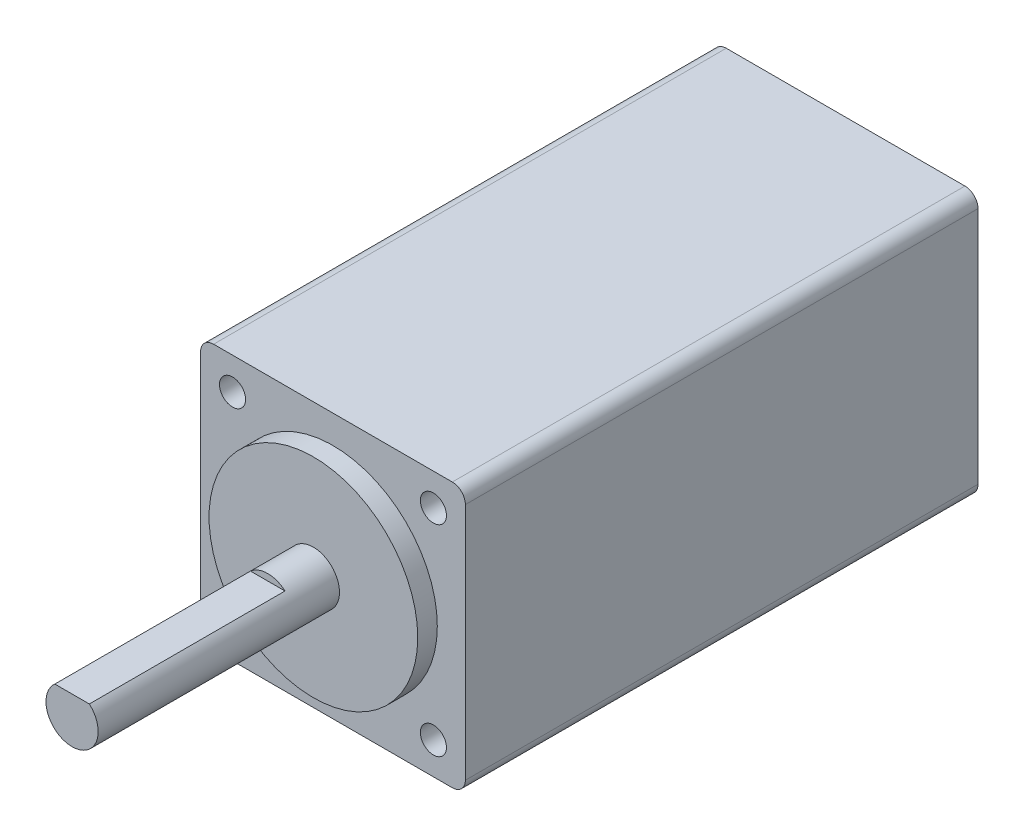
ISO-10303-21;
HEADER;
FILE_DESCRIPTION(('STEP AP214'),'2;1');
FILE_NAME('part.step','',(''),(''),'','','');
FILE_SCHEMA(('AUTOMOTIVE_DESIGN { 1 0 10303 214 1 1 1 1 }'));
ENDSEC;
DATA;
#1=APPLICATION_CONTEXT('core data for automotive mechanical design processes');
#2=APPLICATION_PROTOCOL_DEFINITION('international standard','automotive_design',2000,#1);
#3=PRODUCT_CONTEXT('',#1,'mechanical');
#4=PRODUCT('Part','Part','',(#3));
#5=PRODUCT_RELATED_PRODUCT_CATEGORY('part','',(#4));
#6=PRODUCT_DEFINITION_FORMATION('','',#4);
#7=PRODUCT_DEFINITION_CONTEXT('part definition',#1,'design');
#8=PRODUCT_DEFINITION('design','',#6,#7);
#9=PRODUCT_DEFINITION_SHAPE('','',#8);
#10=(LENGTH_UNIT() NAMED_UNIT(*) SI_UNIT(.MILLI.,.METRE.));
#11=(NAMED_UNIT(*) PLANE_ANGLE_UNIT() SI_UNIT($,.RADIAN.));
#12=(NAMED_UNIT(*) SI_UNIT($,.STERADIAN.) SOLID_ANGLE_UNIT());
#13=UNCERTAINTY_MEASURE_WITH_UNIT(LENGTH_MEASURE(1.E-05),#10,'distance_accuracy_value','');
#14=(GEOMETRIC_REPRESENTATION_CONTEXT(3) GLOBAL_UNCERTAINTY_ASSIGNED_CONTEXT((#13)) GLOBAL_UNIT_ASSIGNED_CONTEXT((#10,
#11,#12)) REPRESENTATION_CONTEXT('',''));
#15=CARTESIAN_POINT('',(0.,0.,0.));
#16=DIRECTION('',(0.,0.,1.));
#17=DIRECTION('',(1.,0.,0.));
#18=AXIS2_PLACEMENT_3D('',#15,#16,#17);
#19=CARTESIAN_POINT('',(-10.15,10.15,39.3));
#20=DIRECTION('',(1.,0.,0.));
#21=DIRECTION('',(0.,1.,0.));
#22=AXIS2_PLACEMENT_3D('',#19,#20,#21);
#23=PLANE('',#22);
#24=DIRECTION('',(0.,-1.,0.));
#25=VECTOR('',#24,1.);
#26=CARTESIAN_POINT('',(-10.15,10.15,0.));
#27=LINE('',#26,#25);
#28=CARTESIAN_POINT('',(-10.15,9.15,0.));
#29=VERTEX_POINT('',#28);
#30=CARTESIAN_POINT('',(-10.15,-9.15000000000001,0.));
#31=VERTEX_POINT('',#30);
#32=EDGE_CURVE('E163',#29,#31,#27,.T.);
#33=ORIENTED_EDGE('',*,*,#32,.T.);
#34=DIRECTION('',(0.,0.,-1.));
#35=VECTOR('',#34,1.);
#36=CARTESIAN_POINT('',(-10.15,-9.15000000000001,39.3));
#37=LINE('',#36,#35);
#38=CARTESIAN_POINT('',(-10.15,-9.15000000000001,39.3));
#39=VERTEX_POINT('',#38);
#40=EDGE_CURVE('E216',#31,#39,#37,.F.);
#41=ORIENTED_EDGE('',*,*,#40,.T.);
#42=DIRECTION('',(0.,-1.,0.));
#43=VECTOR('',#42,1.);
#44=CARTESIAN_POINT('',(-10.15,10.15,39.3));
#45=LINE('',#44,#43);
#46=CARTESIAN_POINT('',(-10.15,9.15,39.3));
#47=VERTEX_POINT('',#46);
#48=EDGE_CURVE('E166',#47,#39,#45,.T.);
#49=ORIENTED_EDGE('',*,*,#48,.F.);
#50=DIRECTION('',(0.,0.,-1.));
#51=VECTOR('',#50,1.);
#52=CARTESIAN_POINT('',(-10.15,9.15,39.3));
#53=LINE('',#52,#51);
#54=EDGE_CURVE('E213',#47,#29,#53,.T.);
#55=ORIENTED_EDGE('',*,*,#54,.T.);
#56=EDGE_LOOP('',(#33,#41,#49,#55));
#57=FACE_BOUND('',#56,.T.);
#58=ADVANCED_FACE('F37',(#57),#23,.F.);
#59=CARTESIAN_POINT('',(10.15,-10.15,39.3));
#60=DIRECTION('',(0.,1.,0.));
#61=DIRECTION('',(-1.,0.,0.));
#62=AXIS2_PLACEMENT_3D('',#59,#60,#61);
#63=PLANE('',#62);
#64=DIRECTION('',(1.,0.,0.));
#65=VECTOR('',#64,1.);
#66=CARTESIAN_POINT('',(10.15,-10.15,0.));
#67=LINE('',#66,#65);
#68=CARTESIAN_POINT('',(-9.15,-10.15,0.));
#69=VERTEX_POINT('',#68);
#70=CARTESIAN_POINT('',(9.15,-10.15,0.));
#71=VERTEX_POINT('',#70);
#72=EDGE_CURVE('E181',#69,#71,#67,.T.);
#73=ORIENTED_EDGE('',*,*,#72,.T.);
#74=DIRECTION('',(0.,0.,-1.));
#75=VECTOR('',#74,1.);
#76=CARTESIAN_POINT('',(9.15,-10.15,39.3));
#77=LINE('',#76,#75);
#78=CARTESIAN_POINT('',(9.15,-10.15,39.3));
#79=VERTEX_POINT('',#78);
#80=EDGE_CURVE('E203',#71,#79,#77,.F.);
#81=ORIENTED_EDGE('',*,*,#80,.T.);
#82=DIRECTION('',(1.,0.,0.));
#83=VECTOR('',#82,1.);
#84=CARTESIAN_POINT('',(10.15,-10.15,39.3));
#85=LINE('',#84,#83);
#86=CARTESIAN_POINT('',(-9.15,-10.15,39.3));
#87=VERTEX_POINT('',#86);
#88=EDGE_CURVE('E169',#87,#79,#85,.T.);
#89=ORIENTED_EDGE('',*,*,#88,.F.);
#90=DIRECTION('',(0.,0.,-1.));
#91=VECTOR('',#90,1.);
#92=CARTESIAN_POINT('',(-9.15,-10.15,39.3));
#93=LINE('',#92,#91);
#94=EDGE_CURVE('E200',#87,#69,#93,.T.);
#95=ORIENTED_EDGE('',*,*,#94,.T.);
#96=EDGE_LOOP('',(#73,#81,#89,#95));
#97=FACE_BOUND('',#96,.T.);
#98=ADVANCED_FACE('F245',(#97),#63,.F.);
#99=CARTESIAN_POINT('',(10.15,10.15,39.3));
#100=DIRECTION('',(-1.,0.,0.));
#101=DIRECTION('',(0.,-1.,0.));
#102=AXIS2_PLACEMENT_3D('',#99,#100,#101);
#103=PLANE('',#102);
#104=DIRECTION('',(0.,1.,0.));
#105=VECTOR('',#104,1.);
#106=CARTESIAN_POINT('',(10.15,10.15,39.3));
#107=LINE('',#106,#105);
#108=CARTESIAN_POINT('',(10.15,-9.15,39.3));
#109=VERTEX_POINT('',#108);
#110=CARTESIAN_POINT('',(10.15,9.15,39.3));
#111=VERTEX_POINT('',#110);
#112=EDGE_CURVE('E173',#109,#111,#107,.T.);
#113=ORIENTED_EDGE('',*,*,#112,.F.);
#114=DIRECTION('',(0.,0.,-1.));
#115=VECTOR('',#114,1.);
#116=CARTESIAN_POINT('',(10.15,-9.15,39.3));
#117=LINE('',#116,#115);
#118=CARTESIAN_POINT('',(10.15,-9.15,0.));
#119=VERTEX_POINT('',#118);
#120=EDGE_CURVE('E189',#109,#119,#117,.T.);
#121=ORIENTED_EDGE('',*,*,#120,.T.);
#122=DIRECTION('',(0.,1.,0.));
#123=VECTOR('',#122,1.);
#124=CARTESIAN_POINT('',(10.15,10.15,0.));
#125=LINE('',#124,#123);
#126=CARTESIAN_POINT('',(10.15,9.15,0.));
#127=VERTEX_POINT('',#126);
#128=EDGE_CURVE('E184',#119,#127,#125,.T.);
#129=ORIENTED_EDGE('',*,*,#128,.T.);
#130=DIRECTION('',(0.,0.,-1.));
#131=VECTOR('',#130,1.);
#132=CARTESIAN_POINT('',(10.15,9.15,39.3));
#133=LINE('',#132,#131);
#134=EDGE_CURVE('E178',#127,#111,#133,.F.);
#135=ORIENTED_EDGE('',*,*,#134,.T.);
#136=EDGE_LOOP('',(#113,#121,#129,#135));
#137=FACE_BOUND('',#136,.T.);
#138=ADVANCED_FACE('F253',(#137),#103,.F.);
#139=CARTESIAN_POINT('',(10.15,10.15,39.3));
#140=DIRECTION('',(0.,-1.,0.));
#141=DIRECTION('',(1.,0.,0.));
#142=AXIS2_PLACEMENT_3D('',#139,#140,#141);
#143=PLANE('',#142);
#144=DIRECTION('',(-1.,0.,0.));
#145=VECTOR('',#144,1.);
#146=CARTESIAN_POINT('',(10.15,10.15,0.));
#147=LINE('',#146,#145);
#148=CARTESIAN_POINT('',(9.15,10.15,0.));
#149=VERTEX_POINT('',#148);
#150=CARTESIAN_POINT('',(-9.15,10.15,0.));
#151=VERTEX_POINT('',#150);
#152=EDGE_CURVE('E170',#149,#151,#147,.T.);
#153=ORIENTED_EDGE('',*,*,#152,.T.);
#154=DIRECTION('',(0.,0.,-1.));
#155=VECTOR('',#154,1.);
#156=CARTESIAN_POINT('',(-9.15,10.15,39.3));
#157=LINE('',#156,#155);
#158=CARTESIAN_POINT('',(-9.15,10.15,39.3));
#159=VERTEX_POINT('',#158);
#160=EDGE_CURVE('E46',#151,#159,#157,.F.);
#161=ORIENTED_EDGE('',*,*,#160,.T.);
#162=DIRECTION('',(-1.,0.,0.));
#163=VECTOR('',#162,1.);
#164=CARTESIAN_POINT('',(10.15,10.15,39.3));
#165=LINE('',#164,#163);
#166=CARTESIAN_POINT('',(9.15,10.15,39.3));
#167=VERTEX_POINT('',#166);
#168=EDGE_CURVE('E176',#167,#159,#165,.T.);
#169=ORIENTED_EDGE('',*,*,#168,.F.);
#170=DIRECTION('',(0.,0.,-1.));
#171=VECTOR('',#170,1.);
#172=CARTESIAN_POINT('',(9.15,10.15,39.3));
#173=LINE('',#172,#171);
#174=EDGE_CURVE('E218',#167,#149,#173,.T.);
#175=ORIENTED_EDGE('',*,*,#174,.T.);
#176=EDGE_LOOP('',(#153,#161,#169,#175));
#177=FACE_BOUND('',#176,.T.);
#178=ADVANCED_FACE('F222',(#177),#143,.F.);
#179=CARTESIAN_POINT('',(0.,0.,39.3));
#180=DIRECTION('',(0.,0.,-1.));
#181=DIRECTION('',(-1.,0.,0.));
#182=AXIS2_PLACEMENT_3D('',#179,#180,#181);
#183=PLANE('',#182);
#184=CARTESIAN_POINT('',(0.,0.,39.3));
#185=DIRECTION('',(0.,0.,1.));
#186=DIRECTION('',(1.,0.,0.));
#187=AXIS2_PLACEMENT_3D('',#184,#185,#186);
#188=CIRCLE('',#187,8.);
#189=CARTESIAN_POINT('',(8.,0.,39.3));
#190=VERTEX_POINT('',#189);
#191=EDGE_CURVE('E11',#190,#190,#188,.T.);
#192=ORIENTED_EDGE('',*,*,#191,.F.);
#193=EDGE_LOOP('',(#192));
#194=FACE_BOUND('',#193,.T.);
#195=CARTESIAN_POINT('',(7.7,7.7,39.3));
#196=DIRECTION('',(0.,0.,1.));
#197=DIRECTION('',(1.,0.,0.));
#198=AXIS2_PLACEMENT_3D('',#195,#196,#197);
#199=CIRCLE('',#198,0.999999999999999);
#200=CARTESIAN_POINT('',(8.7,7.7,39.3));
#201=VERTEX_POINT('',#200);
#202=EDGE_CURVE('E155',#201,#201,#199,.T.);
#203=ORIENTED_EDGE('',*,*,#202,.F.);
#204=EDGE_LOOP('',(#203));
#205=FACE_BOUND('',#204,.T.);
#206=CARTESIAN_POINT('',(7.7,-7.7,39.3));
#207=DIRECTION('',(0.,0.,1.));
#208=DIRECTION('',(1.,0.,0.));
#209=AXIS2_PLACEMENT_3D('',#206,#207,#208);
#210=CIRCLE('',#209,1.);
#211=CARTESIAN_POINT('',(8.7,-7.7,39.3));
#212=VERTEX_POINT('',#211);
#213=EDGE_CURVE('E149',#212,#212,#210,.T.);
#214=ORIENTED_EDGE('',*,*,#213,.F.);
#215=EDGE_LOOP('',(#214));
#216=FACE_BOUND('',#215,.T.);
#217=CARTESIAN_POINT('',(-7.7,-7.7,39.3));
#218=DIRECTION('',(0.,0.,1.));
#219=DIRECTION('',(1.,0.,0.));
#220=AXIS2_PLACEMENT_3D('',#217,#218,#219);
#221=CIRCLE('',#220,1.);
#222=CARTESIAN_POINT('',(-6.7,-7.7,39.3));
#223=VERTEX_POINT('',#222);
#224=EDGE_CURVE('E142',#223,#223,#221,.T.);
#225=ORIENTED_EDGE('',*,*,#224,.F.);
#226=EDGE_LOOP('',(#225));
#227=FACE_BOUND('',#226,.T.);
#228=CARTESIAN_POINT('',(-7.7,7.7,39.3));
#229=DIRECTION('',(0.,0.,1.));
#230=DIRECTION('',(1.,0.,0.));
#231=AXIS2_PLACEMENT_3D('',#228,#229,#230);
#232=CIRCLE('',#231,1.);
#233=CARTESIAN_POINT('',(-6.7,7.7,39.3));
#234=VERTEX_POINT('',#233);
#235=EDGE_CURVE('E145',#234,#234,#232,.T.);
#236=ORIENTED_EDGE('',*,*,#235,.F.);
#237=EDGE_LOOP('',(#236));
#238=FACE_BOUND('',#237,.T.);
#239=ORIENTED_EDGE('',*,*,#88,.T.);
#240=CARTESIAN_POINT('',(9.15,-9.15,39.3));
#241=DIRECTION('',(0.,0.,-1.));
#242=DIRECTION('',(-1.,0.,0.));
#243=AXIS2_PLACEMENT_3D('',#240,#241,#242);
#244=CIRCLE('',#243,1.);
#245=EDGE_CURVE('E211',#79,#109,#244,.F.);
#246=ORIENTED_EDGE('',*,*,#245,.T.);
#247=ORIENTED_EDGE('',*,*,#112,.T.);
#248=CARTESIAN_POINT('',(9.15,9.15,39.3));
#249=DIRECTION('',(0.,0.,-1.));
#250=DIRECTION('',(-1.,0.,0.));
#251=AXIS2_PLACEMENT_3D('',#248,#249,#250);
#252=CIRCLE('',#251,1.);
#253=EDGE_CURVE('E205',#111,#167,#252,.F.);
#254=ORIENTED_EDGE('',*,*,#253,.T.);
#255=ORIENTED_EDGE('',*,*,#168,.T.);
#256=CARTESIAN_POINT('',(-9.15,9.15,39.3));
#257=DIRECTION('',(0.,0.,-1.));
#258=DIRECTION('',(-1.,0.,0.));
#259=AXIS2_PLACEMENT_3D('',#256,#257,#258);
#260=CIRCLE('',#259,1.);
#261=EDGE_CURVE('E207',#159,#47,#260,.F.);
#262=ORIENTED_EDGE('',*,*,#261,.T.);
#263=ORIENTED_EDGE('',*,*,#48,.T.);
#264=CARTESIAN_POINT('',(-9.15,-9.15000000000001,39.3));
#265=DIRECTION('',(0.,0.,-1.));
#266=DIRECTION('',(-1.,0.,0.));
#267=AXIS2_PLACEMENT_3D('',#264,#265,#266);
#268=CIRCLE('',#267,1.);
#269=EDGE_CURVE('E209',#39,#87,#268,.F.);
#270=ORIENTED_EDGE('',*,*,#269,.T.);
#271=EDGE_LOOP('',(#239,#246,#247,#254,#255,#262,#263,#270));
#272=FACE_BOUND('',#271,.T.);
#273=ADVANCED_FACE('F238',(#194,#205,#216,#227,#238,#272),#183,.F.);
#274=CARTESIAN_POINT('',(0.,0.,0.));
#275=DIRECTION('',(0.,0.,-1.));
#276=DIRECTION('',(-1.,0.,0.));
#277=AXIS2_PLACEMENT_3D('',#274,#275,#276);
#278=PLANE('',#277);
#279=ORIENTED_EDGE('',*,*,#128,.F.);
#280=CARTESIAN_POINT('',(9.15,-9.15,0.));
#281=DIRECTION('',(0.,0.,-1.));
#282=DIRECTION('',(-1.,0.,0.));
#283=AXIS2_PLACEMENT_3D('',#280,#281,#282);
#284=CIRCLE('',#283,1.);
#285=EDGE_CURVE('E198',#119,#71,#284,.T.);
#286=ORIENTED_EDGE('',*,*,#285,.T.);
#287=ORIENTED_EDGE('',*,*,#72,.F.);
#288=CARTESIAN_POINT('',(-9.15,-9.15000000000001,0.));
#289=DIRECTION('',(0.,0.,-1.));
#290=DIRECTION('',(-1.,0.,0.));
#291=AXIS2_PLACEMENT_3D('',#288,#289,#290);
#292=CIRCLE('',#291,1.);
#293=EDGE_CURVE('E196',#69,#31,#292,.T.);
#294=ORIENTED_EDGE('',*,*,#293,.T.);
#295=ORIENTED_EDGE('',*,*,#32,.F.);
#296=CARTESIAN_POINT('',(-9.15,9.15,0.));
#297=DIRECTION('',(0.,0.,-1.));
#298=DIRECTION('',(-1.,0.,0.));
#299=AXIS2_PLACEMENT_3D('',#296,#297,#298);
#300=CIRCLE('',#299,1.);
#301=EDGE_CURVE('E194',#29,#151,#300,.T.);
#302=ORIENTED_EDGE('',*,*,#301,.T.);
#303=ORIENTED_EDGE('',*,*,#152,.F.);
#304=CARTESIAN_POINT('',(9.15,9.15,0.));
#305=DIRECTION('',(0.,0.,-1.));
#306=DIRECTION('',(-1.,0.,0.));
#307=AXIS2_PLACEMENT_3D('',#304,#305,#306);
#308=CIRCLE('',#307,1.);
#309=EDGE_CURVE('E192',#149,#127,#308,.T.);
#310=ORIENTED_EDGE('',*,*,#309,.T.);
#311=EDGE_LOOP('',(#279,#286,#287,#294,#295,#302,#303,#310));
#312=FACE_BOUND('',#311,.T.);
#313=ADVANCED_FACE('F227',(#312),#278,.T.);
#314=CARTESIAN_POINT('',(9.15,-9.15,39.3));
#315=DIRECTION('',(0.,0.,-1.));
#316=DIRECTION('',(-1.,0.,0.));
#317=AXIS2_PLACEMENT_3D('',#314,#315,#316);
#318=CYLINDRICAL_SURFACE('',#317,1.);
#319=ORIENTED_EDGE('',*,*,#245,.F.);
#320=ORIENTED_EDGE('',*,*,#80,.F.);
#321=ORIENTED_EDGE('',*,*,#285,.F.);
#322=ORIENTED_EDGE('',*,*,#120,.F.);
#323=EDGE_LOOP('',(#319,#320,#321,#322));
#324=FACE_BOUND('',#323,.T.);
#325=ADVANCED_FACE('F250',(#324),#318,.T.);
#326=CARTESIAN_POINT('',(-9.15,-9.15000000000001,39.3));
#327=DIRECTION('',(0.,0.,-1.));
#328=DIRECTION('',(-1.,0.,0.));
#329=AXIS2_PLACEMENT_3D('',#326,#327,#328);
#330=CYLINDRICAL_SURFACE('',#329,1.);
#331=ORIENTED_EDGE('',*,*,#269,.F.);
#332=ORIENTED_EDGE('',*,*,#40,.F.);
#333=ORIENTED_EDGE('',*,*,#293,.F.);
#334=ORIENTED_EDGE('',*,*,#94,.F.);
#335=EDGE_LOOP('',(#331,#332,#333,#334));
#336=FACE_BOUND('',#335,.T.);
#337=ADVANCED_FACE('F242',(#336),#330,.T.);
#338=CARTESIAN_POINT('',(-9.15,9.15,39.3));
#339=DIRECTION('',(0.,0.,-1.));
#340=DIRECTION('',(-1.,0.,0.));
#341=AXIS2_PLACEMENT_3D('',#338,#339,#340);
#342=CYLINDRICAL_SURFACE('',#341,1.);
#343=ORIENTED_EDGE('',*,*,#261,.F.);
#344=ORIENTED_EDGE('',*,*,#160,.F.);
#345=ORIENTED_EDGE('',*,*,#301,.F.);
#346=ORIENTED_EDGE('',*,*,#54,.F.);
#347=EDGE_LOOP('',(#343,#344,#345,#346));
#348=FACE_BOUND('',#347,.T.);
#349=ADVANCED_FACE('F232',(#348),#342,.T.);
#350=CARTESIAN_POINT('',(9.15,9.15,39.3));
#351=DIRECTION('',(0.,0.,-1.));
#352=DIRECTION('',(-1.,0.,0.));
#353=AXIS2_PLACEMENT_3D('',#350,#351,#352);
#354=CYLINDRICAL_SURFACE('',#353,1.);
#355=ORIENTED_EDGE('',*,*,#253,.F.);
#356=ORIENTED_EDGE('',*,*,#134,.F.);
#357=ORIENTED_EDGE('',*,*,#309,.F.);
#358=ORIENTED_EDGE('',*,*,#174,.F.);
#359=EDGE_LOOP('',(#355,#356,#357,#358));
#360=FACE_BOUND('',#359,.T.);
#361=ADVANCED_FACE('F39',(#360),#354,.T.);
#362=CARTESIAN_POINT('',(-7.7,7.7,36.8));
#363=DIRECTION('',(0.,0.,1.));
#364=DIRECTION('',(1.,0.,0.));
#365=AXIS2_PLACEMENT_3D('',#362,#363,#364);
#366=CYLINDRICAL_SURFACE('',#365,1.);
#367=CARTESIAN_POINT('',(-7.7,7.7,36.8));
#368=DIRECTION('',(0.,0.,1.));
#369=DIRECTION('',(1.,0.,0.));
#370=AXIS2_PLACEMENT_3D('',#367,#368,#369);
#371=CIRCLE('',#370,1.);
#372=CARTESIAN_POINT('',(-6.7,7.7,36.8));
#373=VERTEX_POINT('',#372);
#374=EDGE_CURVE('E160',#373,#373,#371,.T.);
#375=ORIENTED_EDGE('',*,*,#374,.F.);
#376=EDGE_LOOP('',(#375));
#377=FACE_BOUND('',#376,.T.);
#378=ORIENTED_EDGE('',*,*,#235,.T.);
#379=EDGE_LOOP('',(#378));
#380=FACE_BOUND('',#379,.T.);
#381=ADVANCED_FACE('F256',(#377,#380),#366,.F.);
#382=CARTESIAN_POINT('',(-7.7,7.7,36.8));
#383=DIRECTION('',(0.,0.,1.));
#384=DIRECTION('',(1.,0.,0.));
#385=AXIS2_PLACEMENT_3D('',#382,#383,#384);
#386=PLANE('',#385);
#387=ORIENTED_EDGE('',*,*,#374,.T.);
#388=EDGE_LOOP('',(#387));
#389=FACE_BOUND('',#388,.T.);
#390=ADVANCED_FACE('F261',(#389),#386,.T.);
#391=CARTESIAN_POINT('',(-7.7,-7.7,36.8));
#392=DIRECTION('',(0.,0.,1.));
#393=DIRECTION('',(1.,0.,0.));
#394=AXIS2_PLACEMENT_3D('',#391,#392,#393);
#395=CYLINDRICAL_SURFACE('',#394,1.);
#396=CARTESIAN_POINT('',(-7.7,-7.7,36.8));
#397=DIRECTION('',(0.,0.,1.));
#398=DIRECTION('',(1.,0.,0.));
#399=AXIS2_PLACEMENT_3D('',#396,#397,#398);
#400=CIRCLE('',#399,1.);
#401=CARTESIAN_POINT('',(-6.7,-7.7,36.8));
#402=VERTEX_POINT('',#401);
#403=EDGE_CURVE('E146',#402,#402,#400,.T.);
#404=ORIENTED_EDGE('',*,*,#403,.F.);
#405=EDGE_LOOP('',(#404));
#406=FACE_BOUND('',#405,.T.);
#407=ORIENTED_EDGE('',*,*,#224,.T.);
#408=EDGE_LOOP('',(#407));
#409=FACE_BOUND('',#408,.T.);
#410=ADVANCED_FACE('F306',(#406,#409),#395,.F.);
#411=CARTESIAN_POINT('',(-7.7,-7.7,36.8));
#412=DIRECTION('',(0.,0.,1.));
#413=DIRECTION('',(1.,0.,0.));
#414=AXIS2_PLACEMENT_3D('',#411,#412,#413);
#415=PLANE('',#414);
#416=ORIENTED_EDGE('',*,*,#403,.T.);
#417=EDGE_LOOP('',(#416));
#418=FACE_BOUND('',#417,.T.);
#419=ADVANCED_FACE('F317',(#418),#415,.T.);
#420=CARTESIAN_POINT('',(7.7,-7.7,36.8));
#421=DIRECTION('',(0.,0.,1.));
#422=DIRECTION('',(1.,0.,0.));
#423=AXIS2_PLACEMENT_3D('',#420,#421,#422);
#424=CYLINDRICAL_SURFACE('',#423,1.);
#425=CARTESIAN_POINT('',(7.7,-7.7,36.8));
#426=DIRECTION('',(0.,0.,1.));
#427=DIRECTION('',(1.,0.,0.));
#428=AXIS2_PLACEMENT_3D('',#425,#426,#427);
#429=CIRCLE('',#428,1.);
#430=CARTESIAN_POINT('',(8.7,-7.7,36.8));
#431=VERTEX_POINT('',#430);
#432=EDGE_CURVE('E152',#431,#431,#429,.T.);
#433=ORIENTED_EDGE('',*,*,#432,.F.);
#434=EDGE_LOOP('',(#433));
#435=FACE_BOUND('',#434,.T.);
#436=ORIENTED_EDGE('',*,*,#213,.T.);
#437=EDGE_LOOP('',(#436));
#438=FACE_BOUND('',#437,.T.);
#439=ADVANCED_FACE('F328',(#435,#438),#424,.F.);
#440=CARTESIAN_POINT('',(7.7,-7.7,36.8));
#441=DIRECTION('',(0.,0.,1.));
#442=DIRECTION('',(1.,0.,0.));
#443=AXIS2_PLACEMENT_3D('',#440,#441,#442);
#444=PLANE('',#443);
#445=ORIENTED_EDGE('',*,*,#432,.T.);
#446=EDGE_LOOP('',(#445));
#447=FACE_BOUND('',#446,.T.);
#448=ADVANCED_FACE('F339',(#447),#444,.T.);
#449=CARTESIAN_POINT('',(7.7,7.7,36.8));
#450=DIRECTION('',(0.,0.,1.));
#451=DIRECTION('',(1.,0.,0.));
#452=AXIS2_PLACEMENT_3D('',#449,#450,#451);
#453=CYLINDRICAL_SURFACE('',#452,0.999999999999999);
#454=CARTESIAN_POINT('',(7.7,7.7,36.8));
#455=DIRECTION('',(0.,0.,1.));
#456=DIRECTION('',(1.,0.,0.));
#457=AXIS2_PLACEMENT_3D('',#454,#455,#456);
#458=CIRCLE('',#457,0.999999999999999);
#459=CARTESIAN_POINT('',(8.7,7.7,36.8));
#460=VERTEX_POINT('',#459);
#461=EDGE_CURVE('E140',#460,#460,#458,.T.);
#462=ORIENTED_EDGE('',*,*,#461,.F.);
#463=EDGE_LOOP('',(#462));
#464=FACE_BOUND('',#463,.T.);
#465=ORIENTED_EDGE('',*,*,#202,.T.);
#466=EDGE_LOOP('',(#465));
#467=FACE_BOUND('',#466,.T.);
#468=ADVANCED_FACE('F350',(#464,#467),#453,.F.);
#469=CARTESIAN_POINT('',(7.7,7.7,36.8));
#470=DIRECTION('',(0.,0.,1.));
#471=DIRECTION('',(1.,0.,0.));
#472=AXIS2_PLACEMENT_3D('',#469,#470,#471);
#473=PLANE('',#472);
#474=ORIENTED_EDGE('',*,*,#461,.T.);
#475=EDGE_LOOP('',(#474));
#476=FACE_BOUND('',#475,.T.);
#477=ADVANCED_FACE('F361',(#476),#473,.T.);
#478=CARTESIAN_POINT('',(0.,0.,40.8));
#479=DIRECTION('',(0.,0.,-1.));
#480=DIRECTION('',(-1.,0.,0.));
#481=AXIS2_PLACEMENT_3D('',#478,#479,#480);
#482=CYLINDRICAL_SURFACE('',#481,8.);
#483=CARTESIAN_POINT('',(0.,0.,40.8));
#484=DIRECTION('',(0.,0.,1.));
#485=DIRECTION('',(1.,0.,0.));
#486=AXIS2_PLACEMENT_3D('',#483,#484,#485);
#487=CIRCLE('',#486,8.);
#488=CARTESIAN_POINT('',(8.,0.,40.8));
#489=VERTEX_POINT('',#488);
#490=EDGE_CURVE('E138',#489,#489,#487,.T.);
#491=ORIENTED_EDGE('',*,*,#490,.F.);
#492=EDGE_LOOP('',(#491));
#493=FACE_BOUND('',#492,.T.);
#494=ORIENTED_EDGE('',*,*,#191,.T.);
#495=EDGE_LOOP('',(#494));
#496=FACE_BOUND('',#495,.T.);
#497=ADVANCED_FACE('F372',(#493,#496),#482,.T.);
#498=CARTESIAN_POINT('',(0.,0.,40.8));
#499=DIRECTION('',(0.,0.,1.));
#500=DIRECTION('',(1.,0.,0.));
#501=AXIS2_PLACEMENT_3D('',#498,#499,#500);
#502=PLANE('',#501);
#503=CARTESIAN_POINT('',(0.,0.,40.8));
#504=DIRECTION('',(0.,0.,1.));
#505=DIRECTION('',(1.,0.,0.));
#506=AXIS2_PLACEMENT_3D('',#503,#504,#505);
#507=CIRCLE('',#506,2.);
#508=CARTESIAN_POINT('',(2.,0.,40.8));
#509=VERTEX_POINT('',#508);
#510=EDGE_CURVE('E41',#509,#509,#507,.F.);
#511=ORIENTED_EDGE('',*,*,#510,.T.);
#512=EDGE_LOOP('',(#511));
#513=FACE_BOUND('',#512,.T.);
#514=ORIENTED_EDGE('',*,*,#490,.T.);
#515=EDGE_LOOP('',(#514));
#516=FACE_BOUND('',#515,.T.);
#517=ADVANCED_FACE('F396',(#513,#516),#502,.T.);
#518=CARTESIAN_POINT('',(0.,0.,59.3));
#519=DIRECTION('',(0.,0.,-1.));
#520=DIRECTION('',(-1.,0.,0.));
#521=AXIS2_PLACEMENT_3D('',#518,#519,#520);
#522=CYLINDRICAL_SURFACE('',#521,2.);
#523=CARTESIAN_POINT('',(0.,0.,59.3));
#524=DIRECTION('',(0.,0.,1.));
#525=DIRECTION('',(1.,0.,0.));
#526=AXIS2_PLACEMENT_3D('',#523,#524,#525);
#527=CIRCLE('',#526,2.);
#528=CARTESIAN_POINT('',(-1.3228756555323,1.5,59.3));
#529=VERTEX_POINT('',#528);
#530=CARTESIAN_POINT('',(1.3228756555323,1.5,59.3));
#531=VERTEX_POINT('',#530);
#532=EDGE_CURVE('E132',#529,#531,#527,.T.);
#533=ORIENTED_EDGE('',*,*,#532,.F.);
#534=DIRECTION('',(0.,0.,1.));
#535=VECTOR('',#534,1.);
#536=CARTESIAN_POINT('',(-1.3228756555323,1.5,44.3));
#537=LINE('',#536,#535);
#538=CARTESIAN_POINT('',(-1.3228756555323,1.5,44.3));
#539=VERTEX_POINT('',#538);
#540=EDGE_CURVE('E54',#539,#529,#537,.T.);
#541=ORIENTED_EDGE('',*,*,#540,.F.);
#542=CARTESIAN_POINT('',(0.,0.,44.3));
#543=DIRECTION('',(0.,0.,1.));
#544=DIRECTION('',(1.,0.,0.));
#545=AXIS2_PLACEMENT_3D('',#542,#543,#544);
#546=CIRCLE('',#545,2.);
#547=CARTESIAN_POINT('',(1.3228756555323,1.5,44.3));
#548=VERTEX_POINT('',#547);
#549=EDGE_CURVE('E118',#548,#539,#546,.T.);
#550=ORIENTED_EDGE('',*,*,#549,.F.);
#551=DIRECTION('',(0.,0.,1.));
#552=VECTOR('',#551,1.);
#553=CARTESIAN_POINT('',(1.3228756555323,1.5,44.3));
#554=LINE('',#553,#552);
#555=EDGE_CURVE('E126',#548,#531,#554,.T.);
#556=ORIENTED_EDGE('',*,*,#555,.T.);
#557=EDGE_LOOP('',(#533,#541,#550,#556));
#558=FACE_BOUND('',#557,.T.);
#559=ORIENTED_EDGE('',*,*,#510,.F.);
#560=EDGE_LOOP('',(#559));
#561=FACE_BOUND('',#560,.T.);
#562=ADVANCED_FACE('F129',(#558,#561),#522,.T.);
#563=CARTESIAN_POINT('',(0.,0.,59.3));
#564=DIRECTION('',(0.,0.,1.));
#565=DIRECTION('',(1.,0.,0.));
#566=AXIS2_PLACEMENT_3D('',#563,#564,#565);
#567=PLANE('',#566);
#568=DIRECTION('',(1.,0.,0.));
#569=VECTOR('',#568,1.);
#570=CARTESIAN_POINT('',(-1.3228756555323,1.5,59.3));
#571=LINE('',#570,#569);
#572=EDGE_CURVE('E123',#529,#531,#571,.T.);
#573=ORIENTED_EDGE('',*,*,#572,.F.);
#574=ORIENTED_EDGE('',*,*,#532,.T.);
#575=EDGE_LOOP('',(#573,#574));
#576=FACE_BOUND('',#575,.T.);
#577=ADVANCED_FACE('F417',(#576),#567,.T.);
#578=CARTESIAN_POINT('',(-1.3228756555323,1.5,44.3));
#579=DIRECTION('',(0.,-1.,0.));
#580=DIRECTION('',(0.,0.,-1.));
#581=AXIS2_PLACEMENT_3D('',#578,#579,#580);
#582=PLANE('',#581);
#583=ORIENTED_EDGE('',*,*,#572,.T.);
#584=ORIENTED_EDGE('',*,*,#555,.F.);
#585=DIRECTION('',(1.,0.,0.));
#586=VECTOR('',#585,1.);
#587=CARTESIAN_POINT('',(-1.3228756555323,1.5,44.3));
#588=LINE('',#587,#586);
#589=EDGE_CURVE('E120',#539,#548,#588,.T.);
#590=ORIENTED_EDGE('',*,*,#589,.F.);
#591=ORIENTED_EDGE('',*,*,#540,.T.);
#592=EDGE_LOOP('',(#583,#584,#590,#591));
#593=FACE_BOUND('',#592,.T.);
#594=ADVANCED_FACE('F125',(#593),#582,.F.);
#595=CARTESIAN_POINT('',(0.,0.,44.3));
#596=DIRECTION('',(0.,0.,1.));
#597=DIRECTION('',(1.,0.,0.));
#598=AXIS2_PLACEMENT_3D('',#595,#596,#597);
#599=PLANE('',#598);
#600=ORIENTED_EDGE('',*,*,#549,.T.);
#601=ORIENTED_EDGE('',*,*,#589,.T.);
#602=EDGE_LOOP('',(#600,#601));
#603=FACE_BOUND('',#602,.T.);
#604=ADVANCED_FACE('F119',(#603),#599,.T.);
#605=CLOSED_SHELL('',(#58,#98,#138,#178,#273,#313,#325,#337,#349,#361,#381,#390,#410,#419,#439,
#448,#468,#477,#497,#517,#562,#577,#594,#604));
#606=MANIFOLD_SOLID_BREP('B2',#605);
#607=ADVANCED_BREP_SHAPE_REPRESENTATION('',(#18,#606),#14);
#608=SHAPE_DEFINITION_REPRESENTATION(#9,#607);
ENDSEC;
END-ISO-10303-21;
